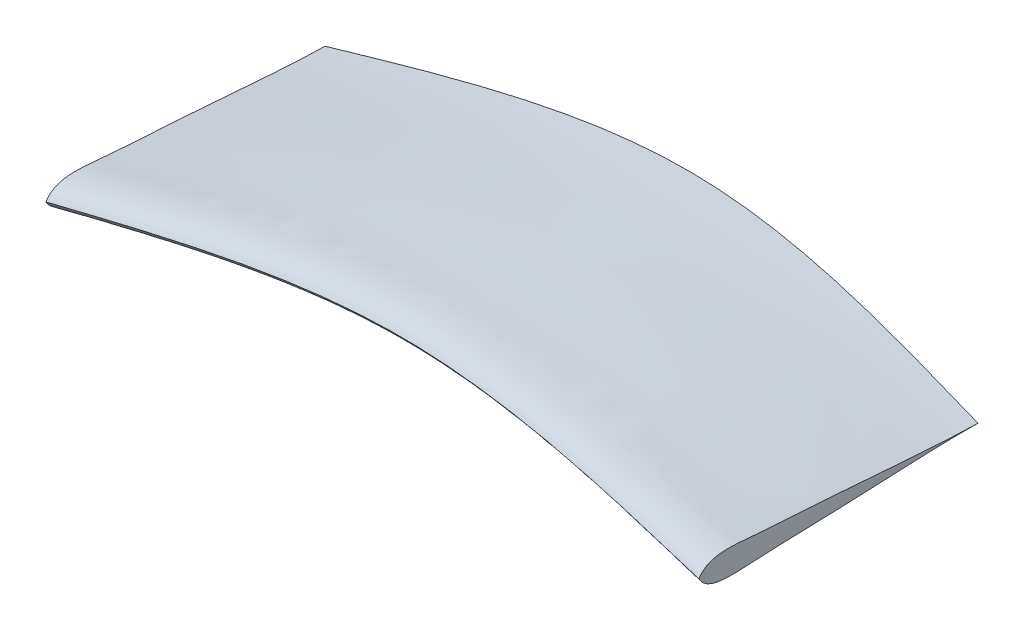
ISO-10303-21;
HEADER;
FILE_DESCRIPTION(('STEP AP214'),'2;1');
FILE_NAME('part.step','',(''),(''),'','','');
FILE_SCHEMA(('AUTOMOTIVE_DESIGN { 1 0 10303 214 1 1 1 1 }'));
ENDSEC;
DATA;
#1=APPLICATION_CONTEXT('core data for automotive mechanical design processes');
#2=APPLICATION_PROTOCOL_DEFINITION('international standard','automotive_design',2000,#1);
#3=PRODUCT_CONTEXT('',#1,'mechanical');
#4=PRODUCT('Part','Part','',(#3));
#5=PRODUCT_RELATED_PRODUCT_CATEGORY('part','',(#4));
#6=PRODUCT_DEFINITION_FORMATION('','',#4);
#7=PRODUCT_DEFINITION_CONTEXT('part definition',#1,'design');
#8=PRODUCT_DEFINITION('design','',#6,#7);
#9=PRODUCT_DEFINITION_SHAPE('','',#8);
#10=(LENGTH_UNIT() NAMED_UNIT(*) SI_UNIT(.MILLI.,.METRE.));
#11=(NAMED_UNIT(*) PLANE_ANGLE_UNIT() SI_UNIT($,.RADIAN.));
#12=(NAMED_UNIT(*) SI_UNIT($,.STERADIAN.) SOLID_ANGLE_UNIT());
#13=UNCERTAINTY_MEASURE_WITH_UNIT(LENGTH_MEASURE(1.E-05),#10,'distance_accuracy_value','');
#14=(GEOMETRIC_REPRESENTATION_CONTEXT(3) GLOBAL_UNCERTAINTY_ASSIGNED_CONTEXT((#13)) GLOBAL_UNIT_ASSIGNED_CONTEXT((#10,
#11,#12)) REPRESENTATION_CONTEXT('',''));
#15=CARTESIAN_POINT('',(0.,0.,0.));
#16=DIRECTION('',(0.,0.,1.));
#17=DIRECTION('',(1.,0.,0.));
#18=AXIS2_PLACEMENT_3D('',#15,#16,#17);
#19=CARTESIAN_POINT('',(-82.3754566085733,-10.6660061601974,4.69681201331419));
#20=DIRECTION('',(-1.,0.,0.));
#21=DIRECTION('',(0.,0.,1.));
#22=AXIS2_PLACEMENT_3D('',#19,#20,#21);
#23=PLANE('',#22);
#24=CARTESIAN_POINT('',(-82.3754566085733,-9.54567468894653,-30.6520183837802));
#25=CARTESIAN_POINT('',(-82.3754566085733,-9.35400866746787,-19.0960637945508));
#26=CARTESIAN_POINT('',(-82.3754566085733,-10.9033071989298,3.65478211388654));
#27=CARTESIAN_POINT('',(-82.3754566085733,-11.1493944990194,24.7102455002481));
#28=CARTESIAN_POINT('',(-82.3754566085733,-12.2753590275172,37.7115051619004));
#29=CARTESIAN_POINT('',(-82.3754566085733,-8.37808383779759,39.7445326093728));
#30=B_SPLINE_CURVE_WITH_KNOTS('',3,(#24,#25,#26,#27,#28,#29),.UNSPECIFIED.,.F.,.F.,(4,1,1,4),
(0.,0.589835437001599,0.807502082157146,1.),.UNSPECIFIED.);
#31=CARTESIAN_POINT('',(-82.3754566085733,-9.54567468894653,-30.6520183837802));
#32=VERTEX_POINT('',#31);
#33=CARTESIAN_POINT('',(-82.3754566085733,-8.37808383779759,39.7445326093728));
#34=VERTEX_POINT('',#33);
#35=EDGE_CURVE('E85',#32,#34,#30,.T.);
#36=ORIENTED_EDGE('',*,*,#35,.T.);
#37=CARTESIAN_POINT('',(-82.3754566085733,-8.37808383779759,39.7445326093728));
#38=CARTESIAN_POINT('',(-82.3754566085733,-4.55037295317391,37.5833792389907));
#39=CARTESIAN_POINT('',(-82.3754566085733,-6.10687499782507,24.6266107261964));
#40=CARTESIAN_POINT('',(-82.3754566085733,-7.05108289346742,3.5908894686905));
#41=CARTESIAN_POINT('',(-82.3754566085733,-9.35400866746788,-19.0960637945508));
#42=CARTESIAN_POINT('',(-82.3754566085733,-9.54567468894653,-30.6520183837802));
#43=B_SPLINE_CURVE_WITH_KNOTS('',3,(#37,#38,#39,#40,#41,#42),.UNSPECIFIED.,.F.,.F.,(4,1,1,4),
(0.,0.192497917842854,0.410164562998401,1.),.UNSPECIFIED.);
#44=EDGE_CURVE('E13',#34,#32,#43,.T.);
#45=ORIENTED_EDGE('',*,*,#44,.T.);
#46=EDGE_LOOP('',(#36,#45));
#47=FACE_BOUND('',#46,.T.);
#48=ADVANCED_FACE('F75',(#47),#23,.T.);
#49=CARTESIAN_POINT('',(82.3754566085732,-10.6660061601974,4.69681201331419));
#50=DIRECTION('',(-1.,0.,0.));
#51=DIRECTION('',(0.,0.,1.));
#52=AXIS2_PLACEMENT_3D('',#49,#50,#51);
#53=PLANE('',#52);
#54=CARTESIAN_POINT('',(82.3754566085732,-8.37808383779759,39.7445326093728));
#55=CARTESIAN_POINT('',(82.3754566085732,-12.2753590275172,37.7115051619004));
#56=CARTESIAN_POINT('',(82.3754566085732,-11.1493944990194,24.7102455002481));
#57=CARTESIAN_POINT('',(82.3754566085732,-10.9033071989298,3.65478211388654));
#58=CARTESIAN_POINT('',(82.3754566085732,-9.35400866746787,-19.0960637945508));
#59=CARTESIAN_POINT('',(82.3754566085732,-9.54567468894653,-30.6520183837802));
#60=B_SPLINE_CURVE_WITH_KNOTS('',3,(#54,#55,#56,#57,#58,#59),.UNSPECIFIED.,.F.,.F.,(4,1,1,4),
(0.,0.192497917842854,0.410164562998401,1.),.UNSPECIFIED.);
#61=CARTESIAN_POINT('',(82.3754566085732,-8.37808383779759,39.7445326093728));
#62=VERTEX_POINT('',#61);
#63=CARTESIAN_POINT('',(82.3754566085732,-9.54567468894653,-30.6520183837802));
#64=VERTEX_POINT('',#63);
#65=EDGE_CURVE('E110',#62,#64,#60,.T.);
#66=ORIENTED_EDGE('',*,*,#65,.T.);
#67=CARTESIAN_POINT('',(82.3754566085732,-9.54567468894653,-30.6520183837802));
#68=CARTESIAN_POINT('',(82.3754566085732,-9.35400866746788,-19.0960637945508));
#69=CARTESIAN_POINT('',(82.3754566085732,-7.05108289346742,3.5908894686905));
#70=CARTESIAN_POINT('',(82.3754566085732,-6.10687499782507,24.6266107261964));
#71=CARTESIAN_POINT('',(82.3754566085732,-4.55037295317391,37.5833792389907));
#72=CARTESIAN_POINT('',(82.3754566085732,-8.37808383779759,39.7445326093728));
#73=B_SPLINE_CURVE_WITH_KNOTS('',3,(#67,#68,#69,#70,#71,#72),.UNSPECIFIED.,.F.,.F.,(4,1,1,4),
(0.,0.589835437001599,0.807502082157146,1.),.UNSPECIFIED.);
#74=EDGE_CURVE('E107',#64,#62,#73,.T.);
#75=ORIENTED_EDGE('',*,*,#74,.T.);
#76=EDGE_LOOP('',(#66,#75));
#77=FACE_BOUND('',#76,.T.);
#78=ADVANCED_FACE('F109',(#77),#53,.F.);
#79=CARTESIAN_POINT('',(82.3754566085732,-8.37808383779759,39.7445326093728));
#80=CARTESIAN_POINT('',(54.9169710723822,-4.1890419188988,36.2775388561386));
#81=CARTESIAN_POINT('',(0.,4.18904191889879,29.3435513496703));
#82=CARTESIAN_POINT('',(-54.9169710723822,-4.18904191889879,36.2775388561386));
#83=CARTESIAN_POINT('',(-82.3754566085733,-8.37808383779759,39.7445326093728));
#84=CARTESIAN_POINT('',(82.3754566085732,-4.55037295317391,37.5833792389907));
#85=CARTESIAN_POINT('',(54.9169710723822,-0.323871232985355,34.0471335025832));
#86=CARTESIAN_POINT('',(0.,8.12913220739175,26.9746420297684));
#87=CARTESIAN_POINT('',(-54.9169710723822,-0.323871232985351,34.0471335025832));
#88=CARTESIAN_POINT('',(-82.3754566085733,-4.55037295317391,37.5833792389907));
#89=CARTESIAN_POINT('',(82.3754566085732,-6.10687499782507,24.6266107261964));
#90=CARTESIAN_POINT('',(54.9169710723822,-1.80055587909945,20.9428064617106));
#91=CARTESIAN_POINT('',(0.,6.8120823583518,13.5751979327391));
#92=CARTESIAN_POINT('',(-54.9169710723822,-1.80055587909945,20.9428064617106));
#93=CARTESIAN_POINT('',(-82.3754566085733,-6.10687499782507,24.6266107261964));
#94=CARTESIAN_POINT('',(82.3754566085732,-7.05108289346742,3.5908894686905));
#95=CARTESIAN_POINT('',(54.9169710723822,-2.55016529955031,-0.45266924898263));
#96=CARTESIAN_POINT('',(0.,6.45166988828392,-8.53978668432889));
#97=CARTESIAN_POINT('',(-54.9169710723822,-2.55016529955031,-0.452669248982633));
#98=CARTESIAN_POINT('',(-82.3754566085733,-7.05108289346742,3.5908894686905));
#99=CARTESIAN_POINT('',(82.3754566085732,-9.35400866746788,-19.0960637945508));
#100=CARTESIAN_POINT('',(54.9169710723822,-4.69595239964903,-23.430124982238));
#101=CARTESIAN_POINT('',(0.,4.62016013598867,-32.0982473576125));
#102=CARTESIAN_POINT('',(-54.9169710723822,-4.69595239964903,-23.430124982238));
#103=CARTESIAN_POINT('',(-82.3754566085733,-9.35400866746788,-19.0960637945508));
#104=CARTESIAN_POINT('',(82.3754566085732,-9.54567468894653,-30.6520183837802));
#105=CARTESIAN_POINT('',(54.9169710723822,-4.77283734447327,-35.1982754965765));
#106=CARTESIAN_POINT('',(0.,4.77283734447326,-44.2907897221691));
#107=CARTESIAN_POINT('',(-54.9169710723822,-4.77283734447326,-35.1982754965765));
#108=CARTESIAN_POINT('',(-82.3754566085733,-9.54567468894653,-30.6520183837802));
#109=B_SPLINE_SURFACE_WITH_KNOTS('',3,3,((#79,#80,#81,#82,#83),(#84,#85,#86,#87,#88),(#89,#90,
#91,#92,#93),(#94,#95,#96,#97,#98),(#99,#100,#101,#102,#103),(#104,#105,#106,#107,#108)),
.UNSPECIFIED.,.F.,.F.,.F.,(4,1,1,4),(4,1,4),(0.,0.192497917842854,0.410164562998401,1.),(0.,0.5,
1.),.UNSPECIFIED.);
#110=CARTESIAN_POINT('',(82.3754566085732,-9.54567468894653,-30.6520183837802));
#111=CARTESIAN_POINT('',(54.9169710723822,-4.77283734447327,-35.1982754965765));
#112=CARTESIAN_POINT('',(0.,4.77283734447326,-44.2907897221691));
#113=CARTESIAN_POINT('',(-54.9169710723822,-4.77283734447326,-35.1982754965765));
#114=CARTESIAN_POINT('',(-82.3754566085733,-9.54567468894653,-30.6520183837802));
#115=B_SPLINE_CURVE_WITH_KNOTS('',3,(#110,#111,#112,#113,#114),.UNSPECIFIED.,.F.,.F.,(4,1,4),
(0.,0.5,1.),.UNSPECIFIED.);
#116=EDGE_CURVE('E120',#64,#32,#115,.T.);
#117=CARTESIAN_POINT('',(82.3754566085732,-8.37808383779759,39.7445326093728));
#118=CARTESIAN_POINT('',(54.9169710723822,-4.1890419188988,36.2775388561386));
#119=CARTESIAN_POINT('',(0.,4.18904191889879,29.3435513496703));
#120=CARTESIAN_POINT('',(-54.9169710723822,-4.18904191889879,36.2775388561386));
#121=CARTESIAN_POINT('',(-82.3754566085733,-8.37808383779759,39.7445326093728));
#122=B_SPLINE_CURVE_WITH_KNOTS('',3,(#117,#118,#119,#120,#121),.UNSPECIFIED.,.F.,.F.,(4,1,4),
(0.,0.5,1.),.UNSPECIFIED.);
#123=EDGE_CURVE('E98',#34,#62,#122,.F.);
#124=ORIENTED_EDGE('',*,*,#74,.F.);
#125=ORIENTED_EDGE('',*,*,#116,.T.);
#126=ORIENTED_EDGE('',*,*,#44,.F.);
#127=ORIENTED_EDGE('',*,*,#123,.T.);
#128=EDGE_LOOP('',(#124,#125,#126,#127));
#129=FACE_BOUND('',#128,.T.);
#130=ADVANCED_FACE('F124',(#129),#109,.T.);
#131=CARTESIAN_POINT('',(82.3754566085732,-9.54567468894653,-30.6520183837802));
#132=CARTESIAN_POINT('',(54.9169710723822,-4.77283734447327,-35.1982754965765));
#133=CARTESIAN_POINT('',(0.,4.77283734447326,-44.2907897221691));
#134=CARTESIAN_POINT('',(-54.9169710723822,-4.77283734447326,-35.1982754965765));
#135=CARTESIAN_POINT('',(-82.3754566085733,-9.54567468894653,-30.6520183837802));
#136=CARTESIAN_POINT('',(82.3754566085732,-9.35400866746787,-19.0960637945508));
#137=CARTESIAN_POINT('',(54.9169710723822,-4.69595239964903,-23.430124982238));
#138=CARTESIAN_POINT('',(0.,4.62016013598867,-32.0982473576125));
#139=CARTESIAN_POINT('',(-54.9169710723822,-4.69595239964902,-23.430124982238));
#140=CARTESIAN_POINT('',(-82.3754566085733,-9.35400866746787,-19.0960637945508));
#141=CARTESIAN_POINT('',(82.3754566085732,-10.9033071989298,3.65478211388654));
#142=CARTESIAN_POINT('',(54.9169710723822,-6.40238960501266,-0.388776603786589));
#143=CARTESIAN_POINT('',(0.,2.59944558282156,-8.47589403913285));
#144=CARTESIAN_POINT('',(-54.9169710723822,-6.40238960501266,-0.388776603786592));
#145=CARTESIAN_POINT('',(-82.3754566085733,-10.9033071989298,3.65478211388654));
#146=CARTESIAN_POINT('',(82.3754566085732,-11.1493944990194,24.7102455002481));
#147=CARTESIAN_POINT('',(54.9169710723822,-6.84307538029373,21.0264412357624));
#148=CARTESIAN_POINT('',(0.,1.76956285715752,13.6588327067909));
#149=CARTESIAN_POINT('',(-54.9169710723822,-6.84307538029373,21.0264412357624));
#150=CARTESIAN_POINT('',(-82.3754566085733,-11.1493944990194,24.7102455002481));
#151=CARTESIAN_POINT('',(82.3754566085732,-12.2753590275172,37.7115051619004));
#152=CARTESIAN_POINT('',(54.9169710723822,-8.04885730732869,34.1752594254929));
#153=CARTESIAN_POINT('',(0.,0.404146133048408,27.1027679526781));
#154=CARTESIAN_POINT('',(-54.9169710723822,-8.04885730732869,34.1752594254929));
#155=CARTESIAN_POINT('',(-82.3754566085733,-12.2753590275172,37.7115051619004));
#156=CARTESIAN_POINT('',(82.3754566085732,-8.37808383779759,39.7445326093728));
#157=CARTESIAN_POINT('',(54.9169710723822,-4.1890419188988,36.2775388561386));
#158=CARTESIAN_POINT('',(0.,4.18904191889879,29.3435513496703));
#159=CARTESIAN_POINT('',(-54.9169710723822,-4.18904191889879,36.2775388561386));
#160=CARTESIAN_POINT('',(-82.3754566085733,-8.37808383779759,39.7445326093728));
#161=B_SPLINE_SURFACE_WITH_KNOTS('',3,3,((#131,#132,#133,#134,#135),(#136,#137,#138,#139,#140),
(#141,#142,#143,#144,#145),(#146,#147,#148,#149,#150),(#151,#152,#153,#154,#155),(#156,#157,
#158,#159,#160)),.UNSPECIFIED.,.F.,.F.,.F.,(4,1,1,4),(4,1,4),(0.,0.589835437001599,
0.807502082157146,1.),(0.,0.5,1.),.UNSPECIFIED.);
#162=ORIENTED_EDGE('',*,*,#65,.F.);
#163=ORIENTED_EDGE('',*,*,#123,.F.);
#164=ORIENTED_EDGE('',*,*,#35,.F.);
#165=ORIENTED_EDGE('',*,*,#116,.F.);
#166=EDGE_LOOP('',(#162,#163,#164,#165));
#167=FACE_BOUND('',#166,.T.);
#168=ADVANCED_FACE('F119',(#167),#161,.T.);
#169=CLOSED_SHELL('',(#48,#78,#130,#168));
#170=MANIFOLD_SOLID_BREP('B2',#169);
#171=ADVANCED_BREP_SHAPE_REPRESENTATION('',(#18,#170),#14);
#172=SHAPE_DEFINITION_REPRESENTATION(#9,#171);
ENDSEC;
END-ISO-10303-21;
